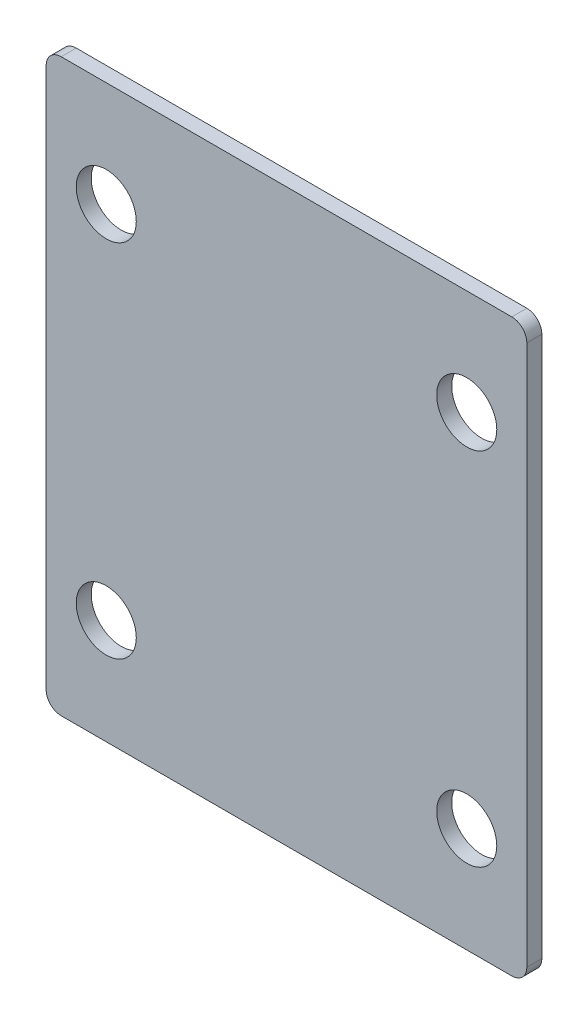
ISO-10303-21;
HEADER;
FILE_DESCRIPTION(('STEP AP214'),'2;1');
FILE_NAME('part.step','',(''),(''),'','','');
FILE_SCHEMA(('AUTOMOTIVE_DESIGN { 1 0 10303 214 1 1 1 1 }'));
ENDSEC;
DATA;
#1=APPLICATION_CONTEXT('core data for automotive mechanical design processes');
#2=APPLICATION_PROTOCOL_DEFINITION('international standard','automotive_design',2000,#1);
#3=PRODUCT_CONTEXT('',#1,'mechanical');
#4=PRODUCT('Part','Part','',(#3));
#5=PRODUCT_RELATED_PRODUCT_CATEGORY('part','',(#4));
#6=PRODUCT_DEFINITION_FORMATION('','',#4);
#7=PRODUCT_DEFINITION_CONTEXT('part definition',#1,'design');
#8=PRODUCT_DEFINITION('design','',#6,#7);
#9=PRODUCT_DEFINITION_SHAPE('','',#8);
#10=(LENGTH_UNIT() NAMED_UNIT(*) SI_UNIT(.MILLI.,.METRE.));
#11=(NAMED_UNIT(*) PLANE_ANGLE_UNIT() SI_UNIT($,.RADIAN.));
#12=(NAMED_UNIT(*) SI_UNIT($,.STERADIAN.) SOLID_ANGLE_UNIT());
#13=UNCERTAINTY_MEASURE_WITH_UNIT(LENGTH_MEASURE(1.E-05),#10,'distance_accuracy_value','');
#14=(GEOMETRIC_REPRESENTATION_CONTEXT(3) GLOBAL_UNCERTAINTY_ASSIGNED_CONTEXT((#13)) GLOBAL_UNIT_ASSIGNED_CONTEXT((#10,
#11,#12)) REPRESENTATION_CONTEXT('',''));
#15=CARTESIAN_POINT('',(0.,0.,0.));
#16=DIRECTION('',(0.,0.,1.));
#17=DIRECTION('',(1.,0.,0.));
#18=AXIS2_PLACEMENT_3D('',#15,#16,#17);
#19=CARTESIAN_POINT('',(0.,9.5,0.5));
#20=DIRECTION('',(0.,-1.,0.));
#21=DIRECTION('',(1.,0.,0.));
#22=AXIS2_PLACEMENT_3D('',#19,#20,#21);
#23=PLANE('',#22);
#24=DIRECTION('',(-1.,0.,0.));
#25=VECTOR('',#24,1.);
#26=CARTESIAN_POINT('',(0.,9.5,0.));
#27=LINE('',#26,#25);
#28=CARTESIAN_POINT('',(7.5,9.5,0.));
#29=VERTEX_POINT('',#28);
#30=CARTESIAN_POINT('',(-7.49999999999999,9.5,0.));
#31=VERTEX_POINT('',#30);
#32=EDGE_CURVE('E164',#29,#31,#27,.T.);
#33=ORIENTED_EDGE('',*,*,#32,.T.);
#34=DIRECTION('',(0.,0.,-1.));
#35=VECTOR('',#34,1.);
#36=CARTESIAN_POINT('',(-7.49999999999999,9.5,0.5));
#37=LINE('',#36,#35);
#38=CARTESIAN_POINT('',(-7.49999999999999,9.5,0.5));
#39=VERTEX_POINT('',#38);
#40=EDGE_CURVE('E11',#39,#31,#37,.T.);
#41=ORIENTED_EDGE('',*,*,#40,.F.);
#42=DIRECTION('',(-1.,0.,0.));
#43=VECTOR('',#42,1.);
#44=CARTESIAN_POINT('',(0.,9.5,0.5));
#45=LINE('',#44,#43);
#46=CARTESIAN_POINT('',(7.5,9.5,0.5));
#47=VERTEX_POINT('',#46);
#48=EDGE_CURVE('E227',#47,#39,#45,.T.);
#49=ORIENTED_EDGE('',*,*,#48,.F.);
#50=DIRECTION('',(0.,0.,-1.));
#51=VECTOR('',#50,1.);
#52=CARTESIAN_POINT('',(7.5,9.5,0.5));
#53=LINE('',#52,#51);
#54=EDGE_CURVE('E63',#47,#29,#53,.T.);
#55=ORIENTED_EDGE('',*,*,#54,.T.);
#56=EDGE_LOOP('',(#33,#41,#49,#55));
#57=FACE_BOUND('',#56,.T.);
#58=ADVANCED_FACE('F45',(#57),#23,.F.);
#59=CARTESIAN_POINT('',(-7.5,9.,0.5));
#60=DIRECTION('',(0.,0.,-1.));
#61=DIRECTION('',(-1.,0.,0.));
#62=AXIS2_PLACEMENT_3D('',#59,#60,#61);
#63=CYLINDRICAL_SURFACE('',#62,0.5);
#64=CARTESIAN_POINT('',(-7.5,9.,0.));
#65=DIRECTION('',(0.,0.,1.));
#66=DIRECTION('',(1.,0.,0.));
#67=AXIS2_PLACEMENT_3D('',#64,#65,#66);
#68=CIRCLE('',#67,0.5);
#69=CARTESIAN_POINT('',(-8.,8.99999999999999,0.));
#70=VERTEX_POINT('',#69);
#71=EDGE_CURVE('E167',#31,#70,#68,.T.);
#72=ORIENTED_EDGE('',*,*,#71,.T.);
#73=DIRECTION('',(0.,0.,-1.));
#74=VECTOR('',#73,1.);
#75=CARTESIAN_POINT('',(-8.,8.99999999999999,0.5));
#76=LINE('',#75,#74);
#77=CARTESIAN_POINT('',(-8.,8.99999999999999,0.5));
#78=VERTEX_POINT('',#77);
#79=EDGE_CURVE('E55',#78,#70,#76,.T.);
#80=ORIENTED_EDGE('',*,*,#79,.F.);
#81=CARTESIAN_POINT('',(-7.5,9.,0.5));
#82=DIRECTION('',(0.,0.,1.));
#83=DIRECTION('',(1.,0.,0.));
#84=AXIS2_PLACEMENT_3D('',#81,#82,#83);
#85=CIRCLE('',#84,0.5);
#86=EDGE_CURVE('E101',#39,#78,#85,.T.);
#87=ORIENTED_EDGE('',*,*,#86,.F.);
#88=ORIENTED_EDGE('',*,*,#40,.T.);
#89=EDGE_LOOP('',(#72,#80,#87,#88));
#90=FACE_BOUND('',#89,.T.);
#91=ADVANCED_FACE('F273',(#90),#63,.T.);
#92=CARTESIAN_POINT('',(-8.,0.,0.5));
#93=DIRECTION('',(1.,0.,0.));
#94=DIRECTION('',(0.,0.,-1.));
#95=AXIS2_PLACEMENT_3D('',#92,#93,#94);
#96=PLANE('',#95);
#97=DIRECTION('',(0.,-1.,0.));
#98=VECTOR('',#97,1.);
#99=CARTESIAN_POINT('',(-8.,0.,0.));
#100=LINE('',#99,#98);
#101=CARTESIAN_POINT('',(-8.,-9.,0.));
#102=VERTEX_POINT('',#101);
#103=EDGE_CURVE('E170',#70,#102,#100,.T.);
#104=ORIENTED_EDGE('',*,*,#103,.T.);
#105=DIRECTION('',(0.,0.,-1.));
#106=VECTOR('',#105,1.);
#107=CARTESIAN_POINT('',(-8.,-9.,0.5));
#108=LINE('',#107,#106);
#109=CARTESIAN_POINT('',(-8.,-9.,0.5));
#110=VERTEX_POINT('',#109);
#111=EDGE_CURVE('E201',#110,#102,#108,.T.);
#112=ORIENTED_EDGE('',*,*,#111,.F.);
#113=DIRECTION('',(0.,-1.,0.));
#114=VECTOR('',#113,1.);
#115=CARTESIAN_POINT('',(-8.,0.,0.5));
#116=LINE('',#115,#114);
#117=EDGE_CURVE('E210',#78,#110,#116,.T.);
#118=ORIENTED_EDGE('',*,*,#117,.F.);
#119=ORIENTED_EDGE('',*,*,#79,.T.);
#120=EDGE_LOOP('',(#104,#112,#118,#119));
#121=FACE_BOUND('',#120,.T.);
#122=ADVANCED_FACE('F208',(#121),#96,.F.);
#123=CARTESIAN_POINT('',(-7.5,-9.,0.5));
#124=DIRECTION('',(0.,0.,-1.));
#125=DIRECTION('',(-1.,0.,0.));
#126=AXIS2_PLACEMENT_3D('',#123,#124,#125);
#127=CYLINDRICAL_SURFACE('',#126,0.5);
#128=CARTESIAN_POINT('',(-7.5,-9.,0.));
#129=DIRECTION('',(0.,0.,1.));
#130=DIRECTION('',(1.,0.,0.));
#131=AXIS2_PLACEMENT_3D('',#128,#129,#130);
#132=CIRCLE('',#131,0.5);
#133=CARTESIAN_POINT('',(-7.49999999999999,-9.5,0.));
#134=VERTEX_POINT('',#133);
#135=EDGE_CURVE('E174',#134,#102,#132,.F.);
#136=ORIENTED_EDGE('',*,*,#135,.F.);
#137=DIRECTION('',(0.,0.,-1.));
#138=VECTOR('',#137,1.);
#139=CARTESIAN_POINT('',(-7.49999999999999,-9.5,0.5));
#140=LINE('',#139,#138);
#141=CARTESIAN_POINT('',(-7.49999999999999,-9.5,0.5));
#142=VERTEX_POINT('',#141);
#143=EDGE_CURVE('E198',#142,#134,#140,.T.);
#144=ORIENTED_EDGE('',*,*,#143,.F.);
#145=CARTESIAN_POINT('',(-7.5,-9.,0.5));
#146=DIRECTION('',(0.,0.,1.));
#147=DIRECTION('',(1.,0.,0.));
#148=AXIS2_PLACEMENT_3D('',#145,#146,#147);
#149=CIRCLE('',#148,0.5);
#150=EDGE_CURVE('E218',#142,#110,#149,.F.);
#151=ORIENTED_EDGE('',*,*,#150,.T.);
#152=ORIENTED_EDGE('',*,*,#111,.T.);
#153=EDGE_LOOP('',(#136,#144,#151,#152));
#154=FACE_BOUND('',#153,.T.);
#155=ADVANCED_FACE('F216',(#154),#127,.T.);
#156=CARTESIAN_POINT('',(0.,-9.5,0.5));
#157=DIRECTION('',(0.,-1.,0.));
#158=DIRECTION('',(1.,0.,0.));
#159=AXIS2_PLACEMENT_3D('',#156,#157,#158);
#160=PLANE('',#159);
#161=DIRECTION('',(-1.,0.,0.));
#162=VECTOR('',#161,1.);
#163=CARTESIAN_POINT('',(0.,-9.5,0.));
#164=LINE('',#163,#162);
#165=CARTESIAN_POINT('',(7.5,-9.5,0.));
#166=VERTEX_POINT('',#165);
#167=EDGE_CURVE('E178',#166,#134,#164,.T.);
#168=ORIENTED_EDGE('',*,*,#167,.F.);
#169=DIRECTION('',(0.,0.,-1.));
#170=VECTOR('',#169,1.);
#171=CARTESIAN_POINT('',(7.5,-9.5,0.5));
#172=LINE('',#171,#170);
#173=CARTESIAN_POINT('',(7.5,-9.5,0.5));
#174=VERTEX_POINT('',#173);
#175=EDGE_CURVE('E127',#174,#166,#172,.T.);
#176=ORIENTED_EDGE('',*,*,#175,.F.);
#177=DIRECTION('',(-1.,0.,0.));
#178=VECTOR('',#177,1.);
#179=CARTESIAN_POINT('',(0.,-9.5,0.5));
#180=LINE('',#179,#178);
#181=EDGE_CURVE('E137',#174,#142,#180,.T.);
#182=ORIENTED_EDGE('',*,*,#181,.T.);
#183=ORIENTED_EDGE('',*,*,#143,.T.);
#184=EDGE_LOOP('',(#168,#176,#182,#183));
#185=FACE_BOUND('',#184,.T.);
#186=ADVANCED_FACE('F304',(#185),#160,.T.);
#187=CARTESIAN_POINT('',(7.5,-9.,0.5));
#188=DIRECTION('',(0.,0.,-1.));
#189=DIRECTION('',(-1.,0.,0.));
#190=AXIS2_PLACEMENT_3D('',#187,#188,#189);
#191=CYLINDRICAL_SURFACE('',#190,0.5);
#192=CARTESIAN_POINT('',(7.5,-9.,0.));
#193=DIRECTION('',(0.,0.,1.));
#194=DIRECTION('',(1.,0.,0.));
#195=AXIS2_PLACEMENT_3D('',#192,#193,#194);
#196=CIRCLE('',#195,0.5);
#197=CARTESIAN_POINT('',(8.,-8.99999999999999,0.));
#198=VERTEX_POINT('',#197);
#199=EDGE_CURVE('E122',#198,#166,#196,.F.);
#200=ORIENTED_EDGE('',*,*,#199,.F.);
#201=DIRECTION('',(0.,0.,-1.));
#202=VECTOR('',#201,1.);
#203=CARTESIAN_POINT('',(8.,-8.99999999999999,0.5));
#204=LINE('',#203,#202);
#205=CARTESIAN_POINT('',(8.,-8.99999999999999,0.5));
#206=VERTEX_POINT('',#205);
#207=EDGE_CURVE('E117',#206,#198,#204,.T.);
#208=ORIENTED_EDGE('',*,*,#207,.F.);
#209=CARTESIAN_POINT('',(7.5,-9.,0.5));
#210=DIRECTION('',(0.,0.,1.));
#211=DIRECTION('',(1.,0.,0.));
#212=AXIS2_PLACEMENT_3D('',#209,#210,#211);
#213=CIRCLE('',#212,0.5);
#214=EDGE_CURVE('E120',#206,#174,#213,.F.);
#215=ORIENTED_EDGE('',*,*,#214,.T.);
#216=ORIENTED_EDGE('',*,*,#175,.T.);
#217=EDGE_LOOP('',(#200,#208,#215,#216));
#218=FACE_BOUND('',#217,.T.);
#219=ADVANCED_FACE('F119',(#218),#191,.T.);
#220=CARTESIAN_POINT('',(8.,0.,0.5));
#221=DIRECTION('',(1.,0.,0.));
#222=DIRECTION('',(0.,0.,-1.));
#223=AXIS2_PLACEMENT_3D('',#220,#221,#222);
#224=PLANE('',#223);
#225=DIRECTION('',(0.,-1.,0.));
#226=VECTOR('',#225,1.);
#227=CARTESIAN_POINT('',(8.,0.,0.));
#228=LINE('',#227,#226);
#229=CARTESIAN_POINT('',(8.,9.,0.));
#230=VERTEX_POINT('',#229);
#231=EDGE_CURVE('E184',#230,#198,#228,.T.);
#232=ORIENTED_EDGE('',*,*,#231,.F.);
#233=DIRECTION('',(0.,0.,-1.));
#234=VECTOR('',#233,1.);
#235=CARTESIAN_POINT('',(8.,9.,0.5));
#236=LINE('',#235,#234);
#237=CARTESIAN_POINT('',(8.,9.,0.5));
#238=VERTEX_POINT('',#237);
#239=EDGE_CURVE('E89',#238,#230,#236,.T.);
#240=ORIENTED_EDGE('',*,*,#239,.F.);
#241=DIRECTION('',(0.,-1.,0.));
#242=VECTOR('',#241,1.);
#243=CARTESIAN_POINT('',(8.,0.,0.5));
#244=LINE('',#243,#242);
#245=EDGE_CURVE('E134',#238,#206,#244,.T.);
#246=ORIENTED_EDGE('',*,*,#245,.T.);
#247=ORIENTED_EDGE('',*,*,#207,.T.);
#248=EDGE_LOOP('',(#232,#240,#246,#247));
#249=FACE_BOUND('',#248,.T.);
#250=ADVANCED_FACE('F140',(#249),#224,.T.);
#251=CARTESIAN_POINT('',(-6.,6.,0.5));
#252=DIRECTION('',(0.,0.,-1.));
#253=DIRECTION('',(-1.,0.,0.));
#254=AXIS2_PLACEMENT_3D('',#251,#252,#253);
#255=CYLINDRICAL_SURFACE('',#254,1.);
#256=CARTESIAN_POINT('',(-6.,6.,0.5));
#257=DIRECTION('',(0.,0.,1.));
#258=DIRECTION('',(1.,0.,0.));
#259=AXIS2_PLACEMENT_3D('',#256,#257,#258);
#260=CIRCLE('',#259,1.);
#261=CARTESIAN_POINT('',(-5.,6.,0.5));
#262=VERTEX_POINT('',#261);
#263=EDGE_CURVE('E230',#262,#262,#260,.T.);
#264=ORIENTED_EDGE('',*,*,#263,.T.);
#265=EDGE_LOOP('',(#264));
#266=FACE_BOUND('',#265,.T.);
#267=CARTESIAN_POINT('',(-6.,6.,0.));
#268=DIRECTION('',(0.,0.,1.));
#269=DIRECTION('',(1.,0.,0.));
#270=AXIS2_PLACEMENT_3D('',#267,#268,#269);
#271=CIRCLE('',#270,1.);
#272=CARTESIAN_POINT('',(-5.,6.,0.));
#273=VERTEX_POINT('',#272);
#274=EDGE_CURVE('E160',#273,#273,#271,.T.);
#275=ORIENTED_EDGE('',*,*,#274,.F.);
#276=EDGE_LOOP('',(#275));
#277=FACE_BOUND('',#276,.T.);
#278=ADVANCED_FACE('F258',(#266,#277),#255,.F.);
#279=CARTESIAN_POINT('',(6.,6.,0.5));
#280=DIRECTION('',(0.,0.,-1.));
#281=DIRECTION('',(-1.,0.,0.));
#282=AXIS2_PLACEMENT_3D('',#279,#280,#281);
#283=CYLINDRICAL_SURFACE('',#282,1.);
#284=CARTESIAN_POINT('',(6.,6.,0.5));
#285=DIRECTION('',(0.,0.,1.));
#286=DIRECTION('',(1.,0.,0.));
#287=AXIS2_PLACEMENT_3D('',#284,#285,#286);
#288=CIRCLE('',#287,1.);
#289=CARTESIAN_POINT('',(7.,6.,0.5));
#290=VERTEX_POINT('',#289);
#291=EDGE_CURVE('E234',#290,#290,#288,.T.);
#292=ORIENTED_EDGE('',*,*,#291,.T.);
#293=EDGE_LOOP('',(#292));
#294=FACE_BOUND('',#293,.T.);
#295=CARTESIAN_POINT('',(6.,6.,0.));
#296=DIRECTION('',(0.,0.,1.));
#297=DIRECTION('',(1.,0.,0.));
#298=AXIS2_PLACEMENT_3D('',#295,#296,#297);
#299=CIRCLE('',#298,1.);
#300=CARTESIAN_POINT('',(7.,6.,0.));
#301=VERTEX_POINT('',#300);
#302=EDGE_CURVE('E156',#301,#301,#299,.T.);
#303=ORIENTED_EDGE('',*,*,#302,.F.);
#304=EDGE_LOOP('',(#303));
#305=FACE_BOUND('',#304,.T.);
#306=ADVANCED_FACE('F261',(#294,#305),#283,.F.);
#307=CARTESIAN_POINT('',(6.00000000000012,-6.,0.5));
#308=DIRECTION('',(0.,0.,-1.));
#309=DIRECTION('',(-1.,0.,0.));
#310=AXIS2_PLACEMENT_3D('',#307,#308,#309);
#311=CYLINDRICAL_SURFACE('',#310,1.);
#312=CARTESIAN_POINT('',(6.00000000000012,-6.,0.5));
#313=DIRECTION('',(0.,0.,1.));
#314=DIRECTION('',(1.,0.,0.));
#315=AXIS2_PLACEMENT_3D('',#312,#313,#314);
#316=CIRCLE('',#315,1.);
#317=CARTESIAN_POINT('',(7.00000000000012,-6.,0.5));
#318=VERTEX_POINT('',#317);
#319=EDGE_CURVE('E238',#318,#318,#316,.T.);
#320=ORIENTED_EDGE('',*,*,#319,.T.);
#321=EDGE_LOOP('',(#320));
#322=FACE_BOUND('',#321,.T.);
#323=CARTESIAN_POINT('',(6.00000000000012,-6.,0.));
#324=DIRECTION('',(0.,0.,1.));
#325=DIRECTION('',(1.,0.,0.));
#326=AXIS2_PLACEMENT_3D('',#323,#324,#325);
#327=CIRCLE('',#326,1.);
#328=CARTESIAN_POINT('',(7.00000000000012,-6.,0.));
#329=VERTEX_POINT('',#328);
#330=EDGE_CURVE('E152',#329,#329,#327,.T.);
#331=ORIENTED_EDGE('',*,*,#330,.F.);
#332=EDGE_LOOP('',(#331));
#333=FACE_BOUND('',#332,.T.);
#334=ADVANCED_FACE('F282',(#322,#333),#311,.F.);
#335=CARTESIAN_POINT('',(-5.99999999999988,-6.,0.5));
#336=DIRECTION('',(0.,0.,-1.));
#337=DIRECTION('',(-1.,0.,0.));
#338=AXIS2_PLACEMENT_3D('',#335,#336,#337);
#339=CYLINDRICAL_SURFACE('',#338,1.);
#340=CARTESIAN_POINT('',(-5.99999999999988,-6.,0.5));
#341=DIRECTION('',(0.,0.,1.));
#342=DIRECTION('',(1.,0.,0.));
#343=AXIS2_PLACEMENT_3D('',#340,#341,#342);
#344=CIRCLE('',#343,1.);
#345=CARTESIAN_POINT('',(-4.99999999999988,-6.,0.5));
#346=VERTEX_POINT('',#345);
#347=EDGE_CURVE('E191',#346,#346,#344,.T.);
#348=ORIENTED_EDGE('',*,*,#347,.T.);
#349=EDGE_LOOP('',(#348));
#350=FACE_BOUND('',#349,.T.);
#351=CARTESIAN_POINT('',(-5.99999999999988,-6.,0.));
#352=DIRECTION('',(0.,0.,1.));
#353=DIRECTION('',(1.,0.,0.));
#354=AXIS2_PLACEMENT_3D('',#351,#352,#353);
#355=CIRCLE('',#354,1.);
#356=CARTESIAN_POINT('',(-4.99999999999988,-6.,0.));
#357=VERTEX_POINT('',#356);
#358=EDGE_CURVE('E148',#357,#357,#355,.T.);
#359=ORIENTED_EDGE('',*,*,#358,.F.);
#360=EDGE_LOOP('',(#359));
#361=FACE_BOUND('',#360,.T.);
#362=ADVANCED_FACE('F47',(#350,#361),#339,.F.);
#363=CARTESIAN_POINT('',(7.5,9.,0.5));
#364=DIRECTION('',(0.,0.,-1.));
#365=DIRECTION('',(-1.,0.,0.));
#366=AXIS2_PLACEMENT_3D('',#363,#364,#365);
#367=CYLINDRICAL_SURFACE('',#366,0.5);
#368=CARTESIAN_POINT('',(7.5,9.,0.));
#369=DIRECTION('',(0.,0.,1.));
#370=DIRECTION('',(1.,0.,0.));
#371=AXIS2_PLACEMENT_3D('',#368,#369,#370);
#372=CIRCLE('',#371,0.5);
#373=EDGE_CURVE('E187',#29,#230,#372,.F.);
#374=ORIENTED_EDGE('',*,*,#373,.F.);
#375=ORIENTED_EDGE('',*,*,#54,.F.);
#376=CARTESIAN_POINT('',(7.5,9.,0.5));
#377=DIRECTION('',(0.,0.,1.));
#378=DIRECTION('',(1.,0.,0.));
#379=AXIS2_PLACEMENT_3D('',#376,#377,#378);
#380=CIRCLE('',#379,0.5);
#381=EDGE_CURVE('E142',#47,#238,#380,.F.);
#382=ORIENTED_EDGE('',*,*,#381,.T.);
#383=ORIENTED_EDGE('',*,*,#239,.T.);
#384=EDGE_LOOP('',(#374,#375,#382,#383));
#385=FACE_BOUND('',#384,.T.);
#386=ADVANCED_FACE('F250',(#385),#367,.T.);
#387=CARTESIAN_POINT('',(0.,0.,0.5));
#388=DIRECTION('',(0.,0.,1.));
#389=DIRECTION('',(1.,0.,0.));
#390=AXIS2_PLACEMENT_3D('',#387,#388,#389);
#391=PLANE('',#390);
#392=ORIENTED_EDGE('',*,*,#347,.F.);
#393=EDGE_LOOP('',(#392));
#394=FACE_BOUND('',#393,.T.);
#395=ORIENTED_EDGE('',*,*,#319,.F.);
#396=EDGE_LOOP('',(#395));
#397=FACE_BOUND('',#396,.T.);
#398=ORIENTED_EDGE('',*,*,#291,.F.);
#399=EDGE_LOOP('',(#398));
#400=FACE_BOUND('',#399,.T.);
#401=ORIENTED_EDGE('',*,*,#263,.F.);
#402=EDGE_LOOP('',(#401));
#403=FACE_BOUND('',#402,.T.);
#404=ORIENTED_EDGE('',*,*,#48,.T.);
#405=ORIENTED_EDGE('',*,*,#86,.T.);
#406=ORIENTED_EDGE('',*,*,#117,.T.);
#407=ORIENTED_EDGE('',*,*,#150,.F.);
#408=ORIENTED_EDGE('',*,*,#181,.F.);
#409=ORIENTED_EDGE('',*,*,#214,.F.);
#410=ORIENTED_EDGE('',*,*,#245,.F.);
#411=ORIENTED_EDGE('',*,*,#381,.F.);
#412=EDGE_LOOP('',(#404,#405,#406,#407,#408,#409,#410,#411));
#413=FACE_BOUND('',#412,.T.);
#414=ADVANCED_FACE('F132',(#394,#397,#400,#403,#413),#391,.T.);
#415=CARTESIAN_POINT('',(0.,0.,0.));
#416=DIRECTION('',(0.,0.,1.));
#417=DIRECTION('',(1.,0.,0.));
#418=AXIS2_PLACEMENT_3D('',#415,#416,#417);
#419=PLANE('',#418);
#420=ORIENTED_EDGE('',*,*,#358,.T.);
#421=EDGE_LOOP('',(#420));
#422=FACE_BOUND('',#421,.T.);
#423=ORIENTED_EDGE('',*,*,#330,.T.);
#424=EDGE_LOOP('',(#423));
#425=FACE_BOUND('',#424,.T.);
#426=ORIENTED_EDGE('',*,*,#302,.T.);
#427=EDGE_LOOP('',(#426));
#428=FACE_BOUND('',#427,.T.);
#429=ORIENTED_EDGE('',*,*,#274,.T.);
#430=EDGE_LOOP('',(#429));
#431=FACE_BOUND('',#430,.T.);
#432=ORIENTED_EDGE('',*,*,#32,.F.);
#433=ORIENTED_EDGE('',*,*,#373,.T.);
#434=ORIENTED_EDGE('',*,*,#231,.T.);
#435=ORIENTED_EDGE('',*,*,#199,.T.);
#436=ORIENTED_EDGE('',*,*,#167,.T.);
#437=ORIENTED_EDGE('',*,*,#135,.T.);
#438=ORIENTED_EDGE('',*,*,#103,.F.);
#439=ORIENTED_EDGE('',*,*,#71,.F.);
#440=EDGE_LOOP('',(#432,#433,#434,#435,#436,#437,#438,#439));
#441=FACE_BOUND('',#440,.T.);
#442=ADVANCED_FACE('F212',(#422,#425,#428,#431,#441),#419,.F.);
#443=CLOSED_SHELL('',(#58,#91,#122,#155,#186,#219,#250,#278,#306,#334,#362,#386,#414,#442));
#444=MANIFOLD_SOLID_BREP('B2',#443);
#445=ADVANCED_BREP_SHAPE_REPRESENTATION('',(#18,#444),#14);
#446=SHAPE_DEFINITION_REPRESENTATION(#9,#445);
ENDSEC;
END-ISO-10303-21;
